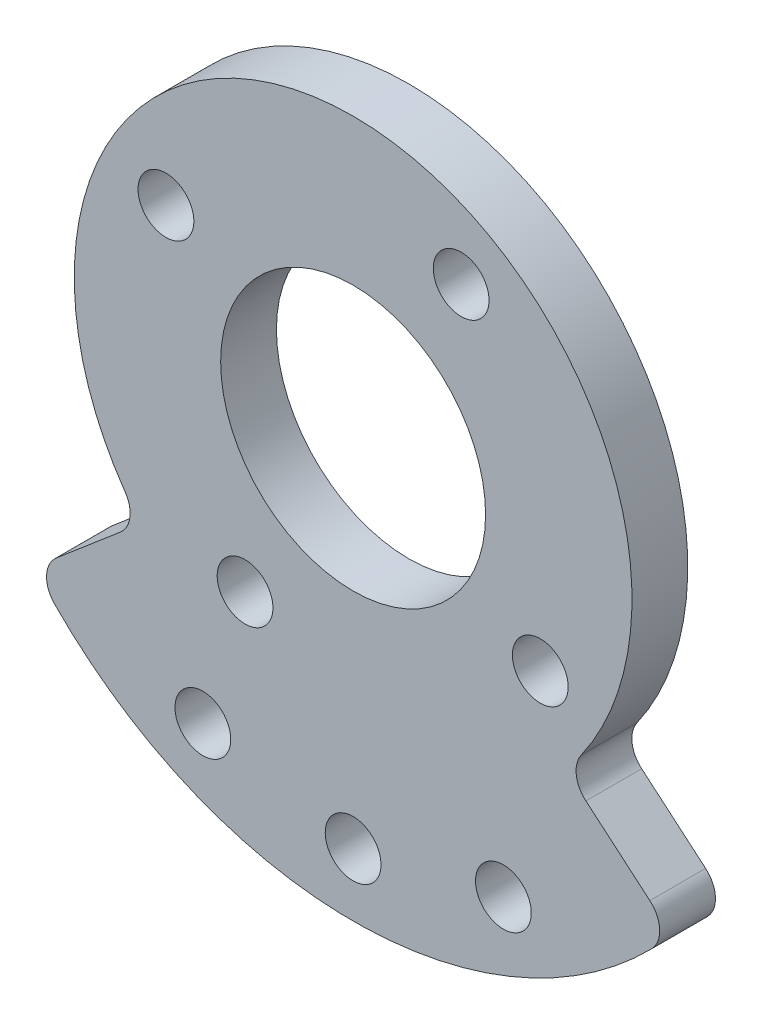
ISO-10303-21;
HEADER;
FILE_DESCRIPTION(('STEP AP214'),'2;1');
FILE_NAME('part.step','',(''),(''),'','','');
FILE_SCHEMA(('AUTOMOTIVE_DESIGN { 1 0 10303 214 1 1 1 1 }'));
ENDSEC;
DATA;
#1=APPLICATION_CONTEXT('core data for automotive mechanical design processes');
#2=APPLICATION_PROTOCOL_DEFINITION('international standard','automotive_design',2000,#1);
#3=PRODUCT_CONTEXT('',#1,'mechanical');
#4=PRODUCT('Part','Part','',(#3));
#5=PRODUCT_RELATED_PRODUCT_CATEGORY('part','',(#4));
#6=PRODUCT_DEFINITION_FORMATION('','',#4);
#7=PRODUCT_DEFINITION_CONTEXT('part definition',#1,'design');
#8=PRODUCT_DEFINITION('design','',#6,#7);
#9=PRODUCT_DEFINITION_SHAPE('','',#8);
#10=(LENGTH_UNIT() NAMED_UNIT(*) SI_UNIT(.MILLI.,.METRE.));
#11=(NAMED_UNIT(*) PLANE_ANGLE_UNIT() SI_UNIT($,.RADIAN.));
#12=(NAMED_UNIT(*) SI_UNIT($,.STERADIAN.) SOLID_ANGLE_UNIT());
#13=UNCERTAINTY_MEASURE_WITH_UNIT(LENGTH_MEASURE(1.E-05),#10,'distance_accuracy_value','');
#14=(GEOMETRIC_REPRESENTATION_CONTEXT(3) GLOBAL_UNCERTAINTY_ASSIGNED_CONTEXT((#13)) GLOBAL_UNIT_ASSIGNED_CONTEXT((#10,
#11,#12)) REPRESENTATION_CONTEXT('',''));
#15=CARTESIAN_POINT('',(0.,0.,0.));
#16=DIRECTION('',(0.,0.,1.));
#17=DIRECTION('',(1.,0.,0.));
#18=AXIS2_PLACEMENT_3D('',#15,#16,#17);
#19=CARTESIAN_POINT('',(0.,0.,4.));
#20=DIRECTION('',(0.,0.,1.));
#21=DIRECTION('',(1.,0.,0.));
#22=AXIS2_PLACEMENT_3D('',#19,#20,#21);
#23=PLANE('',#22);
#24=CARTESIAN_POINT('',(-13.4233937586588,7.75000000000002,4.));
#25=DIRECTION('',(0.,0.,-1.));
#26=DIRECTION('',(-1.,0.,0.));
#27=AXIS2_PLACEMENT_3D('',#24,#25,#26);
#28=CIRCLE('',#27,2.);
#29=CARTESIAN_POINT('',(-15.4233937586588,7.75000000000002,4.));
#30=VERTEX_POINT('',#29);
#31=EDGE_CURVE('E203',#30,#30,#28,.T.);
#32=ORIENTED_EDGE('',*,*,#31,.T.);
#33=EDGE_LOOP('',(#32));
#34=FACE_BOUND('',#33,.T.);
#35=CARTESIAN_POINT('',(-7.7500000000006,-13.4233937586589,4.));
#36=DIRECTION('',(0.,0.,-1.));
#37=DIRECTION('',(-1.,0.,0.));
#38=AXIS2_PLACEMENT_3D('',#35,#36,#37);
#39=CIRCLE('',#38,1.99999999999969);
#40=CARTESIAN_POINT('',(-9.7500000000003,-13.4233937586589,4.));
#41=VERTEX_POINT('',#40);
#42=EDGE_CURVE('E299',#41,#41,#39,.T.);
#43=ORIENTED_EDGE('',*,*,#42,.T.);
#44=EDGE_LOOP('',(#43));
#45=FACE_BOUND('',#44,.T.);
#46=CARTESIAN_POINT('',(13.4233937586584,-7.75000000000076,4.));
#47=DIRECTION('',(0.,0.,-1.));
#48=DIRECTION('',(-1.,0.,0.));
#49=AXIS2_PLACEMENT_3D('',#46,#47,#48);
#50=CIRCLE('',#49,2.00000000000022);
#51=CARTESIAN_POINT('',(11.4233937586581,-7.75000000000076,4.));
#52=VERTEX_POINT('',#51);
#53=EDGE_CURVE('E302',#52,#52,#50,.T.);
#54=ORIENTED_EDGE('',*,*,#53,.T.);
#55=EDGE_LOOP('',(#54));
#56=FACE_BOUND('',#55,.T.);
#57=CARTESIAN_POINT('',(7.75000000000018,13.4233937586582,4.));
#58=DIRECTION('',(0.,0.,-1.));
#59=DIRECTION('',(-1.,0.,0.));
#60=AXIS2_PLACEMENT_3D('',#57,#58,#59);
#61=CIRCLE('',#60,2.00000000000055);
#62=CARTESIAN_POINT('',(5.74999999999963,13.4233937586582,4.));
#63=VERTEX_POINT('',#62);
#64=EDGE_CURVE('E306',#63,#63,#61,.T.);
#65=ORIENTED_EDGE('',*,*,#64,.T.);
#66=EDGE_LOOP('',(#65));
#67=FACE_BOUND('',#66,.T.);
#68=DIRECTION('',(0.762028777775652,0.647543158285025,0.));
#69=VECTOR('',#68,1.);
#70=CARTESIAN_POINT('',(-15.2405755555131,-12.9508631657005,4.));
#71=LINE('',#70,#69);
#72=CARTESIAN_POINT('',(-21.2823055462381,-18.0848962019847,4.));
#73=VERTEX_POINT('',#72);
#74=CARTESIAN_POINT('',(-16.6952140422327,-14.1869597900339,4.));
#75=VERTEX_POINT('',#74);
#76=EDGE_CURVE('E159',#73,#75,#71,.T.);
#77=ORIENTED_EDGE('',*,*,#76,.F.);
#78=CARTESIAN_POINT('',(-19.9872192296681,-19.608953757536,4.));
#79=DIRECTION('',(0.,0.,1.));
#80=DIRECTION('',(1.,0.,0.));
#81=AXIS2_PLACEMENT_3D('',#78,#79,#80);
#82=CIRCLE('',#81,2.);
#83=CARTESIAN_POINT('',(-21.414877746073,-21.0095933116457,4.));
#84=VERTEX_POINT('',#83);
#85=EDGE_CURVE('E48',#73,#84,#82,.T.);
#86=ORIENTED_EDGE('',*,*,#85,.T.);
#87=CARTESIAN_POINT('',(0.,0.,4.));
#88=DIRECTION('',(0.,0.,-1.));
#89=DIRECTION('',(-1.,0.,0.));
#90=AXIS2_PLACEMENT_3D('',#87,#88,#89);
#91=CIRCLE('',#90,30.);
#92=CARTESIAN_POINT('',(21.414877746073,-21.0095933116457,4.));
#93=VERTEX_POINT('',#92);
#94=EDGE_CURVE('E158',#93,#84,#91,.T.);
#95=ORIENTED_EDGE('',*,*,#94,.F.);
#96=CARTESIAN_POINT('',(19.9872192296681,-19.608953757536,4.));
#97=DIRECTION('',(0.,0.,1.));
#98=DIRECTION('',(1.,0.,0.));
#99=AXIS2_PLACEMENT_3D('',#96,#97,#98);
#100=CIRCLE('',#99,2.);
#101=CARTESIAN_POINT('',(21.2823055462381,-18.0848962019847,4.));
#102=VERTEX_POINT('',#101);
#103=EDGE_CURVE('E55',#93,#102,#100,.T.);
#104=ORIENTED_EDGE('',*,*,#103,.T.);
#105=DIRECTION('',(0.762028777775652,-0.647543158285025,0.));
#106=VECTOR('',#105,1.);
#107=CARTESIAN_POINT('',(15.2405755555131,-12.9508631657005,4.));
#108=LINE('',#107,#106);
#109=CARTESIAN_POINT('',(16.6952140422327,-14.1869597900339,4.));
#110=VERTEX_POINT('',#109);
#111=EDGE_CURVE('E111',#110,#102,#108,.T.);
#112=ORIENTED_EDGE('',*,*,#111,.F.);
#113=CARTESIAN_POINT('',(17.9903003588027,-12.6629022344826,4.));
#114=DIRECTION('',(0.,0.,1.));
#115=DIRECTION('',(1.,0.,0.));
#116=AXIS2_PLACEMENT_3D('',#113,#114,#115);
#117=CIRCLE('',#116,2.);
#118=CARTESIAN_POINT('',(16.3548185080025,-11.5117293040751,4.));
#119=VERTEX_POINT('',#118);
#120=EDGE_CURVE('E106',#110,#119,#117,.F.);
#121=ORIENTED_EDGE('',*,*,#120,.T.);
#122=CARTESIAN_POINT('',(0.,0.,4.));
#123=DIRECTION('',(0.,0.,1.));
#124=DIRECTION('',(1.,0.,0.));
#125=AXIS2_PLACEMENT_3D('',#122,#123,#124);
#126=CIRCLE('',#125,20.);
#127=CARTESIAN_POINT('',(-16.3548185080025,-11.5117293040751,4.));
#128=VERTEX_POINT('',#127);
#129=EDGE_CURVE('E110',#119,#128,#126,.T.);
#130=ORIENTED_EDGE('',*,*,#129,.T.);
#131=CARTESIAN_POINT('',(-17.9903003588027,-12.6629022344826,4.));
#132=DIRECTION('',(0.,0.,1.));
#133=DIRECTION('',(1.,0.,0.));
#134=AXIS2_PLACEMENT_3D('',#131,#132,#133);
#135=CIRCLE('',#134,2.);
#136=EDGE_CURVE('E142',#128,#75,#135,.F.);
#137=ORIENTED_EDGE('',*,*,#136,.T.);
#138=EDGE_LOOP('',(#77,#86,#95,#104,#112,#121,#130,#137));
#139=FACE_BOUND('',#138,.T.);
#140=CARTESIAN_POINT('',(10.7767656743878,-23.1108485694346,4.));
#141=DIRECTION('',(0.,0.,-1.));
#142=DIRECTION('',(-1.,0.,0.));
#143=AXIS2_PLACEMENT_3D('',#140,#141,#142);
#144=CIRCLE('',#143,2.);
#145=CARTESIAN_POINT('',(8.77676567438785,-23.1108485694346,4.));
#146=VERTEX_POINT('',#145);
#147=EDGE_CURVE('E177',#146,#146,#144,.T.);
#148=ORIENTED_EDGE('',*,*,#147,.T.);
#149=EDGE_LOOP('',(#148));
#150=FACE_BOUND('',#149,.T.);
#151=CARTESIAN_POINT('',(0.,-25.5,4.));
#152=DIRECTION('',(0.,0.,-1.));
#153=DIRECTION('',(-1.,0.,0.));
#154=AXIS2_PLACEMENT_3D('',#151,#152,#153);
#155=CIRCLE('',#154,2.);
#156=CARTESIAN_POINT('',(-2.,-25.5,4.));
#157=VERTEX_POINT('',#156);
#158=EDGE_CURVE('E215',#157,#157,#155,.T.);
#159=ORIENTED_EDGE('',*,*,#158,.T.);
#160=EDGE_LOOP('',(#159));
#161=FACE_BOUND('',#160,.T.);
#162=CARTESIAN_POINT('',(-10.7767656743879,-23.1108485694346,4.));
#163=DIRECTION('',(0.,0.,-1.));
#164=DIRECTION('',(1.,0.,0.));
#165=AXIS2_PLACEMENT_3D('',#162,#163,#164);
#166=CIRCLE('',#165,2.);
#167=CARTESIAN_POINT('',(-8.77676567438786,-23.1108485694346,4.));
#168=VERTEX_POINT('',#167);
#169=EDGE_CURVE('E221',#168,#168,#166,.T.);
#170=ORIENTED_EDGE('',*,*,#169,.T.);
#171=EDGE_LOOP('',(#170));
#172=FACE_BOUND('',#171,.T.);
#173=CARTESIAN_POINT('',(0.,0.,4.));
#174=DIRECTION('',(0.,0.,1.));
#175=DIRECTION('',(1.,0.,0.));
#176=AXIS2_PLACEMENT_3D('',#173,#174,#175);
#177=CIRCLE('',#176,9.5);
#178=CARTESIAN_POINT('',(9.5,0.,4.));
#179=VERTEX_POINT('',#178);
#180=EDGE_CURVE('E209',#179,#179,#177,.T.);
#181=ORIENTED_EDGE('',*,*,#180,.F.);
#182=EDGE_LOOP('',(#181));
#183=FACE_BOUND('',#182,.T.);
#184=ADVANCED_FACE('F40',(#34,#45,#56,#67,#139,#150,#161,#172,#183),#23,.T.);
#185=CARTESIAN_POINT('',(0.,0.,0.));
#186=DIRECTION('',(0.,0.,1.));
#187=DIRECTION('',(1.,0.,0.));
#188=AXIS2_PLACEMENT_3D('',#185,#186,#187);
#189=PLANE('',#188);
#190=CARTESIAN_POINT('',(-7.7500000000006,-13.4233937586589,0.));
#191=DIRECTION('',(0.,0.,1.));
#192=DIRECTION('',(1.,0.,0.));
#193=AXIS2_PLACEMENT_3D('',#190,#191,#192);
#194=CIRCLE('',#193,1.99999999999969);
#195=CARTESIAN_POINT('',(-5.75000000000091,-13.4233937586589,0.));
#196=VERTEX_POINT('',#195);
#197=EDGE_CURVE('E135',#196,#196,#194,.T.);
#198=ORIENTED_EDGE('',*,*,#197,.T.);
#199=EDGE_LOOP('',(#198));
#200=FACE_BOUND('',#199,.T.);
#201=CARTESIAN_POINT('',(7.75000000000018,13.4233937586582,0.));
#202=DIRECTION('',(0.,0.,1.));
#203=DIRECTION('',(1.,0.,0.));
#204=AXIS2_PLACEMENT_3D('',#201,#202,#203);
#205=CIRCLE('',#204,2.00000000000055);
#206=CARTESIAN_POINT('',(9.75000000000073,13.4233937586582,0.));
#207=VERTEX_POINT('',#206);
#208=EDGE_CURVE('E190',#207,#207,#205,.T.);
#209=ORIENTED_EDGE('',*,*,#208,.T.);
#210=EDGE_LOOP('',(#209));
#211=FACE_BOUND('',#210,.T.);
#212=CARTESIAN_POINT('',(10.7767656743878,-23.1108485694346,0.));
#213=DIRECTION('',(0.,0.,-1.));
#214=DIRECTION('',(-1.,0.,0.));
#215=AXIS2_PLACEMENT_3D('',#212,#213,#214);
#216=CIRCLE('',#215,2.);
#217=CARTESIAN_POINT('',(8.77676567438785,-23.1108485694346,0.));
#218=VERTEX_POINT('',#217);
#219=EDGE_CURVE('E182',#218,#218,#216,.T.);
#220=ORIENTED_EDGE('',*,*,#219,.F.);
#221=EDGE_LOOP('',(#220));
#222=FACE_BOUND('',#221,.T.);
#223=CARTESIAN_POINT('',(0.,-25.5,0.));
#224=DIRECTION('',(0.,0.,-1.));
#225=DIRECTION('',(-1.,0.,0.));
#226=AXIS2_PLACEMENT_3D('',#223,#224,#225);
#227=CIRCLE('',#226,2.);
#228=CARTESIAN_POINT('',(-2.,-25.5,0.));
#229=VERTEX_POINT('',#228);
#230=EDGE_CURVE('E218',#229,#229,#227,.T.);
#231=ORIENTED_EDGE('',*,*,#230,.F.);
#232=EDGE_LOOP('',(#231));
#233=FACE_BOUND('',#232,.T.);
#234=CARTESIAN_POINT('',(-10.7767656743879,-23.1108485694346,0.));
#235=DIRECTION('',(0.,0.,-1.));
#236=DIRECTION('',(1.,0.,0.));
#237=AXIS2_PLACEMENT_3D('',#234,#235,#236);
#238=CIRCLE('',#237,2.);
#239=CARTESIAN_POINT('',(-8.77676567438786,-23.1108485694346,0.));
#240=VERTEX_POINT('',#239);
#241=EDGE_CURVE('E211',#240,#240,#238,.T.);
#242=ORIENTED_EDGE('',*,*,#241,.F.);
#243=EDGE_LOOP('',(#242));
#244=FACE_BOUND('',#243,.T.);
#245=CARTESIAN_POINT('',(0.,0.,0.));
#246=DIRECTION('',(0.,0.,-1.));
#247=DIRECTION('',(-1.,0.,0.));
#248=AXIS2_PLACEMENT_3D('',#245,#246,#247);
#249=CIRCLE('',#248,30.);
#250=CARTESIAN_POINT('',(21.414877746073,-21.0095933116457,0.));
#251=VERTEX_POINT('',#250);
#252=CARTESIAN_POINT('',(-21.414877746073,-21.0095933116457,0.));
#253=VERTEX_POINT('',#252);
#254=EDGE_CURVE('E167',#251,#253,#249,.T.);
#255=ORIENTED_EDGE('',*,*,#254,.T.);
#256=CARTESIAN_POINT('',(-19.9872192296681,-19.608953757536,0.));
#257=DIRECTION('',(0.,0.,1.));
#258=DIRECTION('',(1.,0.,0.));
#259=AXIS2_PLACEMENT_3D('',#256,#257,#258);
#260=CIRCLE('',#259,2.);
#261=CARTESIAN_POINT('',(-21.2823055462381,-18.0848962019847,0.));
#262=VERTEX_POINT('',#261);
#263=EDGE_CURVE('E153',#253,#262,#260,.F.);
#264=ORIENTED_EDGE('',*,*,#263,.T.);
#265=DIRECTION('',(0.762028777775652,0.647543158285025,0.));
#266=VECTOR('',#265,1.);
#267=CARTESIAN_POINT('',(-15.2405755555131,-12.9508631657005,0.));
#268=LINE('',#267,#266);
#269=CARTESIAN_POINT('',(-16.6952140422327,-14.1869597900339,0.));
#270=VERTEX_POINT('',#269);
#271=EDGE_CURVE('E173',#262,#270,#268,.T.);
#272=ORIENTED_EDGE('',*,*,#271,.T.);
#273=CARTESIAN_POINT('',(-17.9903003588027,-12.6629022344826,0.));
#274=DIRECTION('',(0.,0.,1.));
#275=DIRECTION('',(1.,0.,0.));
#276=AXIS2_PLACEMENT_3D('',#273,#274,#275);
#277=CIRCLE('',#276,2.);
#278=CARTESIAN_POINT('',(-16.3548185080025,-11.5117293040751,0.));
#279=VERTEX_POINT('',#278);
#280=EDGE_CURVE('E117',#270,#279,#277,.T.);
#281=ORIENTED_EDGE('',*,*,#280,.T.);
#282=CARTESIAN_POINT('',(0.,0.,0.));
#283=DIRECTION('',(0.,0.,1.));
#284=DIRECTION('',(1.,0.,0.));
#285=AXIS2_PLACEMENT_3D('',#282,#283,#284);
#286=CIRCLE('',#285,20.);
#287=CARTESIAN_POINT('',(16.3548185080025,-11.5117293040751,0.));
#288=VERTEX_POINT('',#287);
#289=EDGE_CURVE('E127',#288,#279,#286,.T.);
#290=ORIENTED_EDGE('',*,*,#289,.F.);
#291=CARTESIAN_POINT('',(17.9903003588027,-12.6629022344826,0.));
#292=DIRECTION('',(0.,0.,1.));
#293=DIRECTION('',(1.,0.,0.));
#294=AXIS2_PLACEMENT_3D('',#291,#292,#293);
#295=CIRCLE('',#294,2.);
#296=CARTESIAN_POINT('',(16.6952140422327,-14.1869597900339,0.));
#297=VERTEX_POINT('',#296);
#298=EDGE_CURVE('E116',#288,#297,#295,.T.);
#299=ORIENTED_EDGE('',*,*,#298,.T.);
#300=DIRECTION('',(0.762028777775652,-0.647543158285025,0.));
#301=VECTOR('',#300,1.);
#302=CARTESIAN_POINT('',(15.2405755555131,-12.9508631657005,0.));
#303=LINE('',#302,#301);
#304=CARTESIAN_POINT('',(21.2823055462381,-18.0848962019847,0.));
#305=VERTEX_POINT('',#304);
#306=EDGE_CURVE('E179',#297,#305,#303,.T.);
#307=ORIENTED_EDGE('',*,*,#306,.T.);
#308=CARTESIAN_POINT('',(19.9872192296681,-19.608953757536,0.));
#309=DIRECTION('',(0.,0.,1.));
#310=DIRECTION('',(1.,0.,0.));
#311=AXIS2_PLACEMENT_3D('',#308,#309,#310);
#312=CIRCLE('',#311,2.);
#313=EDGE_CURVE('E151',#305,#251,#312,.F.);
#314=ORIENTED_EDGE('',*,*,#313,.T.);
#315=EDGE_LOOP('',(#255,#264,#272,#281,#290,#299,#307,#314));
#316=FACE_BOUND('',#315,.T.);
#317=CARTESIAN_POINT('',(0.,0.,0.));
#318=DIRECTION('',(0.,0.,-1.));
#319=DIRECTION('',(-1.,0.,0.));
#320=AXIS2_PLACEMENT_3D('',#317,#318,#319);
#321=CIRCLE('',#320,9.5);
#322=CARTESIAN_POINT('',(-9.5,0.,0.));
#323=VERTEX_POINT('',#322);
#324=EDGE_CURVE('E196',#323,#323,#321,.T.);
#325=ORIENTED_EDGE('',*,*,#324,.F.);
#326=EDGE_LOOP('',(#325));
#327=FACE_BOUND('',#326,.T.);
#328=CARTESIAN_POINT('',(-13.4233937586588,7.75000000000002,0.));
#329=DIRECTION('',(0.,0.,1.));
#330=DIRECTION('',(1.,0.,0.));
#331=AXIS2_PLACEMENT_3D('',#328,#329,#330);
#332=CIRCLE('',#331,2.);
#333=CARTESIAN_POINT('',(-11.4233937586588,7.75000000000002,0.));
#334=VERTEX_POINT('',#333);
#335=EDGE_CURVE('E192',#334,#334,#332,.T.);
#336=ORIENTED_EDGE('',*,*,#335,.T.);
#337=EDGE_LOOP('',(#336));
#338=FACE_BOUND('',#337,.T.);
#339=CARTESIAN_POINT('',(13.4233937586584,-7.75000000000076,0.));
#340=DIRECTION('',(0.,0.,1.));
#341=DIRECTION('',(1.,0.,0.));
#342=AXIS2_PLACEMENT_3D('',#339,#340,#341);
#343=CIRCLE('',#342,2.00000000000022);
#344=CARTESIAN_POINT('',(15.4233937586586,-7.75000000000076,0.));
#345=VERTEX_POINT('',#344);
#346=EDGE_CURVE('E198',#345,#345,#343,.T.);
#347=ORIENTED_EDGE('',*,*,#346,.T.);
#348=EDGE_LOOP('',(#347));
#349=FACE_BOUND('',#348,.T.);
#350=ADVANCED_FACE('F171',(#200,#211,#222,#233,#244,#316,#327,#338,#349),#189,.F.);
#351=CARTESIAN_POINT('',(0.,0.,4.));
#352=DIRECTION('',(0.,0.,-1.));
#353=DIRECTION('',(-1.,0.,0.));
#354=AXIS2_PLACEMENT_3D('',#351,#352,#353);
#355=CYLINDRICAL_SURFACE('',#354,20.);
#356=ORIENTED_EDGE('',*,*,#289,.T.);
#357=DIRECTION('',(0.,0.,-1.));
#358=VECTOR('',#357,1.);
#359=CARTESIAN_POINT('',(-16.3548185080025,-11.5117293040751,4.));
#360=LINE('',#359,#358);
#361=EDGE_CURVE('E126',#279,#128,#360,.F.);
#362=ORIENTED_EDGE('',*,*,#361,.T.);
#363=ORIENTED_EDGE('',*,*,#129,.F.);
#364=DIRECTION('',(0.,0.,-1.));
#365=VECTOR('',#364,1.);
#366=CARTESIAN_POINT('',(16.3548185080025,-11.5117293040751,4.));
#367=LINE('',#366,#365);
#368=EDGE_CURVE('E123',#119,#288,#367,.T.);
#369=ORIENTED_EDGE('',*,*,#368,.T.);
#370=EDGE_LOOP('',(#356,#362,#363,#369));
#371=FACE_BOUND('',#370,.T.);
#372=ADVANCED_FACE('F122',(#371),#355,.T.);
#373=CARTESIAN_POINT('',(0.,0.,4.));
#374=DIRECTION('',(0.,0.,-1.));
#375=DIRECTION('',(-1.,0.,0.));
#376=AXIS2_PLACEMENT_3D('',#373,#374,#375);
#377=CYLINDRICAL_SURFACE('',#376,30.);
#378=ORIENTED_EDGE('',*,*,#94,.T.);
#379=DIRECTION('',(0.,0.,-1.));
#380=VECTOR('',#379,1.);
#381=CARTESIAN_POINT('',(-21.414877746073,-21.0095933116457,4.));
#382=LINE('',#381,#380);
#383=EDGE_CURVE('E148',#84,#253,#382,.T.);
#384=ORIENTED_EDGE('',*,*,#383,.T.);
#385=ORIENTED_EDGE('',*,*,#254,.F.);
#386=DIRECTION('',(0.,0.,-1.));
#387=VECTOR('',#386,1.);
#388=CARTESIAN_POINT('',(21.414877746073,-21.0095933116457,4.));
#389=LINE('',#388,#387);
#390=EDGE_CURVE('E146',#251,#93,#389,.F.);
#391=ORIENTED_EDGE('',*,*,#390,.T.);
#392=EDGE_LOOP('',(#378,#384,#385,#391));
#393=FACE_BOUND('',#392,.T.);
#394=ADVANCED_FACE('F163',(#393),#377,.T.);
#395=CARTESIAN_POINT('',(15.2405755555131,-12.9508631657005,4.));
#396=DIRECTION('',(0.647543158285025,0.762028777775652,0.));
#397=DIRECTION('',(-0.762028777775652,0.647543158285025,0.));
#398=AXIS2_PLACEMENT_3D('',#395,#396,#397);
#399=PLANE('',#398);
#400=ORIENTED_EDGE('',*,*,#111,.T.);
#401=DIRECTION('',(0.,0.,-1.));
#402=VECTOR('',#401,1.);
#403=CARTESIAN_POINT('',(21.2823055462381,-18.0848962019847,4.));
#404=LINE('',#403,#402);
#405=EDGE_CURVE('E11',#102,#305,#404,.T.);
#406=ORIENTED_EDGE('',*,*,#405,.T.);
#407=ORIENTED_EDGE('',*,*,#306,.F.);
#408=DIRECTION('',(0.,0.,-1.));
#409=VECTOR('',#408,1.);
#410=CARTESIAN_POINT('',(16.6952140422327,-14.1869597900339,4.));
#411=LINE('',#410,#409);
#412=EDGE_CURVE('E140',#297,#110,#411,.F.);
#413=ORIENTED_EDGE('',*,*,#412,.T.);
#414=EDGE_LOOP('',(#400,#406,#407,#413));
#415=FACE_BOUND('',#414,.T.);
#416=ADVANCED_FACE('F256',(#415),#399,.T.);
#417=CARTESIAN_POINT('',(-15.2405755555131,-12.9508631657005,4.));
#418=DIRECTION('',(-0.647543158285025,0.762028777775652,0.));
#419=DIRECTION('',(-0.762028777775652,-0.647543158285025,0.));
#420=AXIS2_PLACEMENT_3D('',#417,#418,#419);
#421=PLANE('',#420);
#422=ORIENTED_EDGE('',*,*,#271,.F.);
#423=DIRECTION('',(0.,0.,-1.));
#424=VECTOR('',#423,1.);
#425=CARTESIAN_POINT('',(-21.2823055462381,-18.0848962019847,4.));
#426=LINE('',#425,#424);
#427=EDGE_CURVE('E63',#262,#73,#426,.F.);
#428=ORIENTED_EDGE('',*,*,#427,.T.);
#429=ORIENTED_EDGE('',*,*,#76,.T.);
#430=DIRECTION('',(0.,0.,-1.));
#431=VECTOR('',#430,1.);
#432=CARTESIAN_POINT('',(-16.6952140422327,-14.1869597900339,4.));
#433=LINE('',#432,#431);
#434=EDGE_CURVE('E132',#75,#270,#433,.T.);
#435=ORIENTED_EDGE('',*,*,#434,.T.);
#436=EDGE_LOOP('',(#422,#428,#429,#435));
#437=FACE_BOUND('',#436,.T.);
#438=ADVANCED_FACE('F174',(#437),#421,.T.);
#439=CARTESIAN_POINT('',(-10.7767656743879,-23.1108485694346,4.));
#440=DIRECTION('',(0.,0.,-1.));
#441=DIRECTION('',(-1.,0.,0.));
#442=AXIS2_PLACEMENT_3D('',#439,#440,#441);
#443=CYLINDRICAL_SURFACE('',#442,2.);
#444=ORIENTED_EDGE('',*,*,#169,.F.);
#445=EDGE_LOOP('',(#444));
#446=FACE_BOUND('',#445,.T.);
#447=ORIENTED_EDGE('',*,*,#241,.T.);
#448=EDGE_LOOP('',(#447));
#449=FACE_BOUND('',#448,.T.);
#450=ADVANCED_FACE('F226',(#446,#449),#443,.F.);
#451=CARTESIAN_POINT('',(0.,-25.5,4.));
#452=DIRECTION('',(0.,0.,-1.));
#453=DIRECTION('',(-1.,0.,0.));
#454=AXIS2_PLACEMENT_3D('',#451,#452,#453);
#455=CYLINDRICAL_SURFACE('',#454,2.);
#456=ORIENTED_EDGE('',*,*,#158,.F.);
#457=EDGE_LOOP('',(#456));
#458=FACE_BOUND('',#457,.T.);
#459=ORIENTED_EDGE('',*,*,#230,.T.);
#460=EDGE_LOOP('',(#459));
#461=FACE_BOUND('',#460,.T.);
#462=ADVANCED_FACE('F267',(#458,#461),#455,.F.);
#463=CARTESIAN_POINT('',(10.7767656743878,-23.1108485694346,4.));
#464=DIRECTION('',(0.,0.,-1.));
#465=DIRECTION('',(-1.,0.,0.));
#466=AXIS2_PLACEMENT_3D('',#463,#464,#465);
#467=CYLINDRICAL_SURFACE('',#466,2.);
#468=ORIENTED_EDGE('',*,*,#147,.F.);
#469=EDGE_LOOP('',(#468));
#470=FACE_BOUND('',#469,.T.);
#471=ORIENTED_EDGE('',*,*,#219,.T.);
#472=EDGE_LOOP('',(#471));
#473=FACE_BOUND('',#472,.T.);
#474=ADVANCED_FACE('F271',(#470,#473),#467,.F.);
#475=CARTESIAN_POINT('',(0.,0.,10.));
#476=DIRECTION('',(0.,0.,-1.));
#477=DIRECTION('',(-1.,0.,0.));
#478=AXIS2_PLACEMENT_3D('',#475,#476,#477);
#479=CYLINDRICAL_SURFACE('',#478,9.5);
#480=ORIENTED_EDGE('',*,*,#180,.T.);
#481=EDGE_LOOP('',(#480));
#482=FACE_BOUND('',#481,.T.);
#483=ORIENTED_EDGE('',*,*,#324,.T.);
#484=EDGE_LOOP('',(#483));
#485=FACE_BOUND('',#484,.T.);
#486=ADVANCED_FACE('F275',(#482,#485),#479,.F.);
#487=CARTESIAN_POINT('',(7.75000000000018,13.4233937586582,4.));
#488=DIRECTION('',(0.,0.,-1.));
#489=DIRECTION('',(-1.,0.,0.));
#490=AXIS2_PLACEMENT_3D('',#487,#488,#489);
#491=CYLINDRICAL_SURFACE('',#490,2.00000000000055);
#492=ORIENTED_EDGE('',*,*,#64,.F.);
#493=EDGE_LOOP('',(#492));
#494=FACE_BOUND('',#493,.T.);
#495=ORIENTED_EDGE('',*,*,#208,.F.);
#496=EDGE_LOOP('',(#495));
#497=FACE_BOUND('',#496,.T.);
#498=ADVANCED_FACE('F279',(#494,#497),#491,.F.);
#499=CARTESIAN_POINT('',(13.4233937586584,-7.75000000000076,4.));
#500=DIRECTION('',(0.,0.,-1.));
#501=DIRECTION('',(-1.,0.,0.));
#502=AXIS2_PLACEMENT_3D('',#499,#500,#501);
#503=CYLINDRICAL_SURFACE('',#502,2.00000000000022);
#504=ORIENTED_EDGE('',*,*,#53,.F.);
#505=EDGE_LOOP('',(#504));
#506=FACE_BOUND('',#505,.T.);
#507=ORIENTED_EDGE('',*,*,#346,.F.);
#508=EDGE_LOOP('',(#507));
#509=FACE_BOUND('',#508,.T.);
#510=ADVANCED_FACE('F283',(#506,#509),#503,.F.);
#511=CARTESIAN_POINT('',(-7.7500000000006,-13.4233937586589,4.));
#512=DIRECTION('',(0.,0.,-1.));
#513=DIRECTION('',(-1.,0.,0.));
#514=AXIS2_PLACEMENT_3D('',#511,#512,#513);
#515=CYLINDRICAL_SURFACE('',#514,1.99999999999969);
#516=ORIENTED_EDGE('',*,*,#42,.F.);
#517=EDGE_LOOP('',(#516));
#518=FACE_BOUND('',#517,.T.);
#519=ORIENTED_EDGE('',*,*,#197,.F.);
#520=EDGE_LOOP('',(#519));
#521=FACE_BOUND('',#520,.T.);
#522=ADVANCED_FACE('F287',(#518,#521),#515,.F.);
#523=CARTESIAN_POINT('',(-13.4233937586588,7.75000000000002,4.));
#524=DIRECTION('',(0.,0.,-1.));
#525=DIRECTION('',(-1.,0.,0.));
#526=AXIS2_PLACEMENT_3D('',#523,#524,#525);
#527=CYLINDRICAL_SURFACE('',#526,2.);
#528=ORIENTED_EDGE('',*,*,#31,.F.);
#529=EDGE_LOOP('',(#528));
#530=FACE_BOUND('',#529,.T.);
#531=ORIENTED_EDGE('',*,*,#335,.F.);
#532=EDGE_LOOP('',(#531));
#533=FACE_BOUND('',#532,.T.);
#534=ADVANCED_FACE('F243',(#530,#533),#527,.F.);
#535=CARTESIAN_POINT('',(-17.9903003588027,-12.6629022344826,4.));
#536=DIRECTION('',(0.,0.,-1.));
#537=DIRECTION('',(-1.,0.,0.));
#538=AXIS2_PLACEMENT_3D('',#535,#536,#537);
#539=CYLINDRICAL_SURFACE('',#538,2.);
#540=ORIENTED_EDGE('',*,*,#280,.F.);
#541=ORIENTED_EDGE('',*,*,#434,.F.);
#542=ORIENTED_EDGE('',*,*,#136,.F.);
#543=ORIENTED_EDGE('',*,*,#361,.F.);
#544=EDGE_LOOP('',(#540,#541,#542,#543));
#545=FACE_BOUND('',#544,.T.);
#546=ADVANCED_FACE('F240',(#545),#539,.F.);
#547=CARTESIAN_POINT('',(17.9903003588027,-12.6629022344826,4.));
#548=DIRECTION('',(0.,0.,-1.));
#549=DIRECTION('',(-1.,0.,0.));
#550=AXIS2_PLACEMENT_3D('',#547,#548,#549);
#551=CYLINDRICAL_SURFACE('',#550,2.);
#552=ORIENTED_EDGE('',*,*,#298,.F.);
#553=ORIENTED_EDGE('',*,*,#368,.F.);
#554=ORIENTED_EDGE('',*,*,#120,.F.);
#555=ORIENTED_EDGE('',*,*,#412,.F.);
#556=EDGE_LOOP('',(#552,#553,#554,#555));
#557=FACE_BOUND('',#556,.T.);
#558=ADVANCED_FACE('F130',(#557),#551,.F.);
#559=CARTESIAN_POINT('',(-19.9872192296681,-19.608953757536,4.));
#560=DIRECTION('',(0.,0.,-1.));
#561=DIRECTION('',(-1.,0.,0.));
#562=AXIS2_PLACEMENT_3D('',#559,#560,#561);
#563=CYLINDRICAL_SURFACE('',#562,2.);
#564=ORIENTED_EDGE('',*,*,#85,.F.);
#565=ORIENTED_EDGE('',*,*,#427,.F.);
#566=ORIENTED_EDGE('',*,*,#263,.F.);
#567=ORIENTED_EDGE('',*,*,#383,.F.);
#568=EDGE_LOOP('',(#564,#565,#566,#567));
#569=FACE_BOUND('',#568,.T.);
#570=ADVANCED_FACE('F169',(#569),#563,.T.);
#571=CARTESIAN_POINT('',(19.9872192296681,-19.608953757536,4.));
#572=DIRECTION('',(0.,0.,-1.));
#573=DIRECTION('',(-1.,0.,0.));
#574=AXIS2_PLACEMENT_3D('',#571,#572,#573);
#575=CYLINDRICAL_SURFACE('',#574,2.);
#576=ORIENTED_EDGE('',*,*,#103,.F.);
#577=ORIENTED_EDGE('',*,*,#390,.F.);
#578=ORIENTED_EDGE('',*,*,#313,.F.);
#579=ORIENTED_EDGE('',*,*,#405,.F.);
#580=EDGE_LOOP('',(#576,#577,#578,#579));
#581=FACE_BOUND('',#580,.T.);
#582=ADVANCED_FACE('F42',(#581),#575,.T.);
#583=CLOSED_SHELL('',(#184,#350,#372,#394,#416,#438,#450,#462,#474,#486,#498,#510,#522,#534,
#546,#558,#570,#582));
#584=MANIFOLD_SOLID_BREP('B2',#583);
#585=ADVANCED_BREP_SHAPE_REPRESENTATION('',(#18,#584),#14);
#586=SHAPE_DEFINITION_REPRESENTATION(#9,#585);
ENDSEC;
END-ISO-10303-21;
